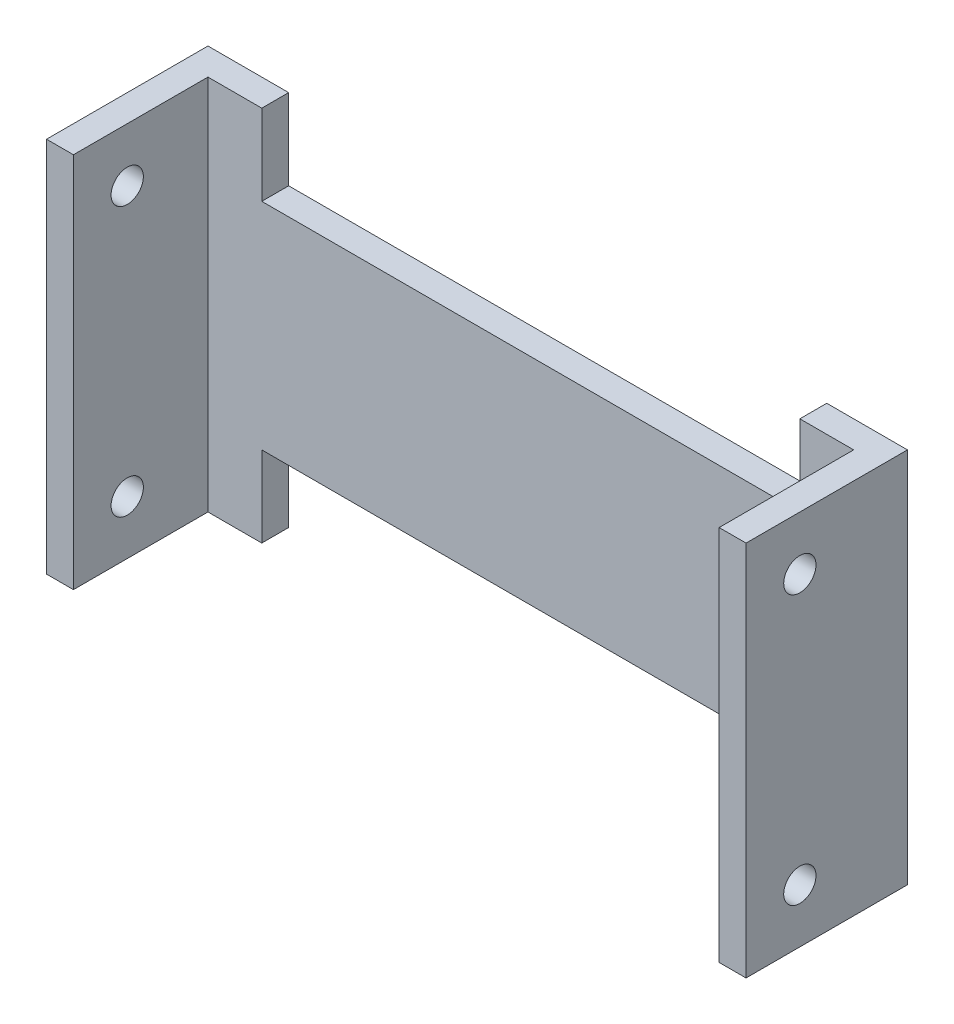
ISO-10303-21;
HEADER;
FILE_DESCRIPTION(('STEP AP214'),'2;1');
FILE_NAME('part.step','',(''),(''),'','','');
FILE_SCHEMA(('AUTOMOTIVE_DESIGN { 1 0 10303 214 1 1 1 1 }'));
ENDSEC;
DATA;
#1=APPLICATION_CONTEXT('core data for automotive mechanical design processes');
#2=APPLICATION_PROTOCOL_DEFINITION('international standard','automotive_design',2000,#1);
#3=PRODUCT_CONTEXT('',#1,'mechanical');
#4=PRODUCT('Part','Part','',(#3));
#5=PRODUCT_RELATED_PRODUCT_CATEGORY('part','',(#4));
#6=PRODUCT_DEFINITION_FORMATION('','',#4);
#7=PRODUCT_DEFINITION_CONTEXT('part definition',#1,'design');
#8=PRODUCT_DEFINITION('design','',#6,#7);
#9=PRODUCT_DEFINITION_SHAPE('','',#8);
#10=(LENGTH_UNIT() NAMED_UNIT(*) SI_UNIT(.MILLI.,.METRE.));
#11=(NAMED_UNIT(*) PLANE_ANGLE_UNIT() SI_UNIT($,.RADIAN.));
#12=(NAMED_UNIT(*) SI_UNIT($,.STERADIAN.) SOLID_ANGLE_UNIT());
#13=UNCERTAINTY_MEASURE_WITH_UNIT(LENGTH_MEASURE(1.E-05),#10,'distance_accuracy_value','');
#14=(GEOMETRIC_REPRESENTATION_CONTEXT(3) GLOBAL_UNCERTAINTY_ASSIGNED_CONTEXT((#13)) GLOBAL_UNIT_ASSIGNED_CONTEXT((#10,
#11,#12)) REPRESENTATION_CONTEXT('',''));
#15=CARTESIAN_POINT('',(0.,0.,0.));
#16=DIRECTION('',(0.,0.,1.));
#17=DIRECTION('',(1.,0.,0.));
#18=AXIS2_PLACEMENT_3D('',#15,#16,#17);
#19=CARTESIAN_POINT('',(0.,35.,0.));
#20=DIRECTION('',(0.,-1.,0.));
#21=DIRECTION('',(0.,0.,-1.));
#22=AXIS2_PLACEMENT_3D('',#19,#20,#21);
#23=PLANE('',#22);
#24=DIRECTION('',(-1.,0.,0.));
#25=VECTOR('',#24,1.);
#26=CARTESIAN_POINT('',(0.,35.,0.));
#27=LINE('',#26,#25);
#28=CARTESIAN_POINT('',(65.,35.,0.));
#29=VERTEX_POINT('',#28);
#30=CARTESIAN_POINT('',(50.,35.,0.));
#31=VERTEX_POINT('',#30);
#32=EDGE_CURVE('E330',#29,#31,#27,.T.);
#33=ORIENTED_EDGE('',*,*,#32,.T.);
#34=DIRECTION('',(0.,0.,-1.));
#35=VECTOR('',#34,1.);
#36=CARTESIAN_POINT('',(50.,35.,106.118742080783));
#37=LINE('',#36,#35);
#38=CARTESIAN_POINT('',(50.,35.,5.));
#39=VERTEX_POINT('',#38);
#40=EDGE_CURVE('E313',#39,#31,#37,.T.);
#41=ORIENTED_EDGE('',*,*,#40,.F.);
#42=DIRECTION('',(1.,0.,0.));
#43=VECTOR('',#42,1.);
#44=CARTESIAN_POINT('',(0.,35.,5.));
#45=LINE('',#44,#43);
#46=CARTESIAN_POINT('',(60.,35.,5.));
#47=VERTEX_POINT('',#46);
#48=EDGE_CURVE('E343',#39,#47,#45,.T.);
#49=ORIENTED_EDGE('',*,*,#48,.T.);
#50=DIRECTION('',(0.,0.,1.));
#51=VECTOR('',#50,1.);
#52=CARTESIAN_POINT('',(60.,35.,5.));
#53=LINE('',#52,#51);
#54=CARTESIAN_POINT('',(60.,35.,30.));
#55=VERTEX_POINT('',#54);
#56=EDGE_CURVE('E215',#47,#55,#53,.T.);
#57=ORIENTED_EDGE('',*,*,#56,.T.);
#58=DIRECTION('',(1.,0.,0.));
#59=VECTOR('',#58,1.);
#60=CARTESIAN_POINT('',(60.,35.,30.));
#61=LINE('',#60,#59);
#62=CARTESIAN_POINT('',(65.,35.,30.));
#63=VERTEX_POINT('',#62);
#64=EDGE_CURVE('E209',#55,#63,#61,.T.);
#65=ORIENTED_EDGE('',*,*,#64,.T.);
#66=DIRECTION('',(0.,0.,-1.));
#67=VECTOR('',#66,1.);
#68=CARTESIAN_POINT('',(65.,35.,0.));
#69=LINE('',#68,#67);
#70=EDGE_CURVE('E326',#63,#29,#69,.T.);
#71=ORIENTED_EDGE('',*,*,#70,.T.);
#72=EDGE_LOOP('',(#33,#41,#49,#57,#65,#71));
#73=FACE_BOUND('',#72,.T.);
#74=ADVANCED_FACE('F39',(#73),#23,.F.);
#75=CARTESIAN_POINT('',(0.,-35.,0.));
#76=DIRECTION('',(0.,-1.,0.));
#77=DIRECTION('',(0.,0.,-1.));
#78=AXIS2_PLACEMENT_3D('',#75,#76,#77);
#79=PLANE('',#78);
#80=DIRECTION('',(0.,0.,-1.));
#81=VECTOR('',#80,1.);
#82=CARTESIAN_POINT('',(50.,-35.,106.118742080783));
#83=LINE('',#82,#81);
#84=CARTESIAN_POINT('',(50.,-35.,5.));
#85=VERTEX_POINT('',#84);
#86=CARTESIAN_POINT('',(50.,-35.,0.));
#87=VERTEX_POINT('',#86);
#88=EDGE_CURVE('E277',#85,#87,#83,.T.);
#89=ORIENTED_EDGE('',*,*,#88,.T.);
#90=DIRECTION('',(-1.,0.,0.));
#91=VECTOR('',#90,1.);
#92=CARTESIAN_POINT('',(0.,-35.,0.));
#93=LINE('',#92,#91);
#94=CARTESIAN_POINT('',(65.,-35.,0.));
#95=VERTEX_POINT('',#94);
#96=EDGE_CURVE('E183',#95,#87,#93,.T.);
#97=ORIENTED_EDGE('',*,*,#96,.F.);
#98=DIRECTION('',(0.,0.,-1.));
#99=VECTOR('',#98,1.);
#100=CARTESIAN_POINT('',(65.,-35.,0.));
#101=LINE('',#100,#99);
#102=CARTESIAN_POINT('',(65.,-35.,30.));
#103=VERTEX_POINT('',#102);
#104=EDGE_CURVE('E184',#103,#95,#101,.T.);
#105=ORIENTED_EDGE('',*,*,#104,.F.);
#106=DIRECTION('',(1.,0.,0.));
#107=VECTOR('',#106,1.);
#108=CARTESIAN_POINT('',(60.,-35.,30.));
#109=LINE('',#108,#107);
#110=CARTESIAN_POINT('',(60.,-35.,30.));
#111=VERTEX_POINT('',#110);
#112=EDGE_CURVE('E189',#111,#103,#109,.T.);
#113=ORIENTED_EDGE('',*,*,#112,.F.);
#114=DIRECTION('',(0.,0.,1.));
#115=VECTOR('',#114,1.);
#116=CARTESIAN_POINT('',(60.,-35.,5.));
#117=LINE('',#116,#115);
#118=CARTESIAN_POINT('',(60.,-35.,5.));
#119=VERTEX_POINT('',#118);
#120=EDGE_CURVE('E206',#119,#111,#117,.T.);
#121=ORIENTED_EDGE('',*,*,#120,.F.);
#122=DIRECTION('',(1.,0.,0.));
#123=VECTOR('',#122,1.);
#124=CARTESIAN_POINT('',(0.,-35.,5.));
#125=LINE('',#124,#123);
#126=EDGE_CURVE('E202',#85,#119,#125,.T.);
#127=ORIENTED_EDGE('',*,*,#126,.F.);
#128=EDGE_LOOP('',(#89,#97,#105,#113,#121,#127));
#129=FACE_BOUND('',#128,.T.);
#130=ADVANCED_FACE('F358',(#129),#79,.T.);
#131=CARTESIAN_POINT('',(60.,35.,30.));
#132=DIRECTION('',(0.,0.,-1.));
#133=DIRECTION('',(-1.,0.,0.));
#134=AXIS2_PLACEMENT_3D('',#131,#132,#133);
#135=PLANE('',#134);
#136=ORIENTED_EDGE('',*,*,#112,.T.);
#137=DIRECTION('',(0.,-1.,0.));
#138=VECTOR('',#137,1.);
#139=CARTESIAN_POINT('',(65.,35.,30.));
#140=LINE('',#139,#138);
#141=EDGE_CURVE('E11',#63,#103,#140,.T.);
#142=ORIENTED_EDGE('',*,*,#141,.F.);
#143=ORIENTED_EDGE('',*,*,#64,.F.);
#144=DIRECTION('',(0.,-1.,0.));
#145=VECTOR('',#144,1.);
#146=CARTESIAN_POINT('',(60.,35.,30.));
#147=LINE('',#146,#145);
#148=EDGE_CURVE('E210',#55,#111,#147,.T.);
#149=ORIENTED_EDGE('',*,*,#148,.T.);
#150=EDGE_LOOP('',(#136,#142,#143,#149));
#151=FACE_BOUND('',#150,.T.);
#152=ADVANCED_FACE('F41',(#151),#135,.F.);
#153=CARTESIAN_POINT('',(65.,35.,0.));
#154=DIRECTION('',(-1.,0.,0.));
#155=DIRECTION('',(0.,0.,1.));
#156=AXIS2_PLACEMENT_3D('',#153,#154,#155);
#157=PLANE('',#156);
#158=CARTESIAN_POINT('',(65.,25.,20.));
#159=DIRECTION('',(-1.,0.,0.));
#160=DIRECTION('',(0.,0.,1.));
#161=AXIS2_PLACEMENT_3D('',#158,#159,#160);
#162=CIRCLE('',#161,3.);
#163=CARTESIAN_POINT('',(65.,25.,23.));
#164=VERTEX_POINT('',#163);
#165=EDGE_CURVE('E240',#164,#164,#162,.T.);
#166=ORIENTED_EDGE('',*,*,#165,.T.);
#167=EDGE_LOOP('',(#166));
#168=FACE_BOUND('',#167,.T.);
#169=CARTESIAN_POINT('',(65.,-25.,20.));
#170=DIRECTION('',(-1.,0.,0.));
#171=DIRECTION('',(0.,0.,-1.));
#172=AXIS2_PLACEMENT_3D('',#169,#170,#171);
#173=CIRCLE('',#172,3.);
#174=CARTESIAN_POINT('',(65.,-25.,17.));
#175=VERTEX_POINT('',#174);
#176=EDGE_CURVE('E254',#175,#175,#173,.T.);
#177=ORIENTED_EDGE('',*,*,#176,.T.);
#178=EDGE_LOOP('',(#177));
#179=FACE_BOUND('',#178,.T.);
#180=ORIENTED_EDGE('',*,*,#104,.T.);
#181=DIRECTION('',(0.,-1.,0.));
#182=VECTOR('',#181,1.);
#183=CARTESIAN_POINT('',(65.,35.,0.));
#184=LINE('',#183,#182);
#185=EDGE_CURVE('E49',#29,#95,#184,.T.);
#186=ORIENTED_EDGE('',*,*,#185,.F.);
#187=ORIENTED_EDGE('',*,*,#70,.F.);
#188=ORIENTED_EDGE('',*,*,#141,.T.);
#189=EDGE_LOOP('',(#180,#186,#187,#188));
#190=FACE_BOUND('',#189,.T.);
#191=ADVANCED_FACE('F362',(#168,#179,#190),#157,.F.);
#192=CARTESIAN_POINT('',(0.,35.,0.));
#193=DIRECTION('',(0.,0.,1.));
#194=DIRECTION('',(1.,0.,0.));
#195=AXIS2_PLACEMENT_3D('',#192,#193,#194);
#196=PLANE('',#195);
#197=CARTESIAN_POINT('',(0.,0.,0.));
#198=DIRECTION('',(0.,0.,-1.));
#199=DIRECTION('',(-1.,0.,0.));
#200=AXIS2_PLACEMENT_3D('',#197,#198,#199);
#201=CIRCLE('',#200,8.);
#202=CARTESIAN_POINT('',(-8.,0.,0.));
#203=VERTEX_POINT('',#202);
#204=EDGE_CURVE('E257',#203,#203,#201,.T.);
#205=ORIENTED_EDGE('',*,*,#204,.F.);
#206=EDGE_LOOP('',(#205));
#207=FACE_BOUND('',#206,.T.);
#208=ORIENTED_EDGE('',*,*,#96,.T.);
#209=DIRECTION('',(0.,-1.,0.));
#210=VECTOR('',#209,1.);
#211=CARTESIAN_POINT('',(50.,-35.,0.));
#212=LINE('',#211,#210);
#213=CARTESIAN_POINT('',(50.,-20.,0.));
#214=VERTEX_POINT('',#213);
#215=EDGE_CURVE('E164',#214,#87,#212,.T.);
#216=ORIENTED_EDGE('',*,*,#215,.F.);
#217=DIRECTION('',(1.,0.,0.));
#218=VECTOR('',#217,1.);
#219=CARTESIAN_POINT('',(50.,-20.,0.));
#220=LINE('',#219,#218);
#221=CARTESIAN_POINT('',(-50.,-20.,0.));
#222=VERTEX_POINT('',#221);
#223=EDGE_CURVE('E174',#222,#214,#220,.T.);
#224=ORIENTED_EDGE('',*,*,#223,.F.);
#225=DIRECTION('',(0.,1.,0.));
#226=VECTOR('',#225,1.);
#227=CARTESIAN_POINT('',(-50.,-20.,0.));
#228=LINE('',#227,#226);
#229=CARTESIAN_POINT('',(-50.,-35.,0.));
#230=VERTEX_POINT('',#229);
#231=EDGE_CURVE('E157',#230,#222,#228,.T.);
#232=ORIENTED_EDGE('',*,*,#231,.F.);
#233=CARTESIAN_POINT('',(-65.,-35.,0.));
#234=VERTEX_POINT('',#233);
#235=EDGE_CURVE('E170',#230,#234,#93,.T.);
#236=ORIENTED_EDGE('',*,*,#235,.T.);
#237=DIRECTION('',(0.,-1.,0.));
#238=VECTOR('',#237,1.);
#239=CARTESIAN_POINT('',(-65.,35.,0.));
#240=LINE('',#239,#238);
#241=CARTESIAN_POINT('',(-65.,35.,0.));
#242=VERTEX_POINT('',#241);
#243=EDGE_CURVE('E231',#242,#234,#240,.T.);
#244=ORIENTED_EDGE('',*,*,#243,.F.);
#245=CARTESIAN_POINT('',(-50.,35.,0.));
#246=VERTEX_POINT('',#245);
#247=EDGE_CURVE('E329',#246,#242,#27,.T.);
#248=ORIENTED_EDGE('',*,*,#247,.F.);
#249=DIRECTION('',(0.,1.,0.));
#250=VECTOR('',#249,1.);
#251=CARTESIAN_POINT('',(-50.,20.,0.));
#252=LINE('',#251,#250);
#253=CARTESIAN_POINT('',(-50.,20.,0.));
#254=VERTEX_POINT('',#253);
#255=EDGE_CURVE('E57',#254,#246,#252,.T.);
#256=ORIENTED_EDGE('',*,*,#255,.F.);
#257=DIRECTION('',(-1.,0.,0.));
#258=VECTOR('',#257,1.);
#259=CARTESIAN_POINT('',(50.,20.,0.));
#260=LINE('',#259,#258);
#261=CARTESIAN_POINT('',(50.,20.,0.));
#262=VERTEX_POINT('',#261);
#263=EDGE_CURVE('E272',#262,#254,#260,.T.);
#264=ORIENTED_EDGE('',*,*,#263,.F.);
#265=DIRECTION('',(0.,-1.,0.));
#266=VECTOR('',#265,1.);
#267=CARTESIAN_POINT('',(50.,35.,0.));
#268=LINE('',#267,#266);
#269=EDGE_CURVE('E306',#31,#262,#268,.T.);
#270=ORIENTED_EDGE('',*,*,#269,.F.);
#271=ORIENTED_EDGE('',*,*,#32,.F.);
#272=ORIENTED_EDGE('',*,*,#185,.T.);
#273=EDGE_LOOP('',(#208,#216,#224,#232,#236,#244,#248,#256,#264,#270,#271,#272));
#274=FACE_BOUND('',#273,.T.);
#275=ADVANCED_FACE('F168',(#207,#274),#196,.F.);
#276=CARTESIAN_POINT('',(-65.,35.,0.));
#277=DIRECTION('',(1.,0.,0.));
#278=DIRECTION('',(0.,0.,-1.));
#279=AXIS2_PLACEMENT_3D('',#276,#277,#278);
#280=PLANE('',#279);
#281=CARTESIAN_POINT('',(-65.,25.,20.));
#282=DIRECTION('',(-1.,0.,0.));
#283=DIRECTION('',(0.,0.,1.));
#284=AXIS2_PLACEMENT_3D('',#281,#282,#283);
#285=CIRCLE('',#284,3.);
#286=CARTESIAN_POINT('',(-65.,25.,23.));
#287=VERTEX_POINT('',#286);
#288=EDGE_CURVE('E248',#287,#287,#285,.T.);
#289=ORIENTED_EDGE('',*,*,#288,.F.);
#290=EDGE_LOOP('',(#289));
#291=FACE_BOUND('',#290,.T.);
#292=CARTESIAN_POINT('',(-65.,-25.,20.));
#293=DIRECTION('',(-1.,0.,0.));
#294=DIRECTION('',(0.,0.,-1.));
#295=AXIS2_PLACEMENT_3D('',#292,#293,#294);
#296=CIRCLE('',#295,3.);
#297=CARTESIAN_POINT('',(-65.,-25.,17.));
#298=VERTEX_POINT('',#297);
#299=EDGE_CURVE('E263',#298,#298,#296,.T.);
#300=ORIENTED_EDGE('',*,*,#299,.F.);
#301=EDGE_LOOP('',(#300));
#302=FACE_BOUND('',#301,.T.);
#303=DIRECTION('',(0.,0.,1.));
#304=VECTOR('',#303,1.);
#305=CARTESIAN_POINT('',(-65.,-35.,0.));
#306=LINE('',#305,#304);
#307=CARTESIAN_POINT('',(-65.,-35.,30.));
#308=VERTEX_POINT('',#307);
#309=EDGE_CURVE('E181',#234,#308,#306,.T.);
#310=ORIENTED_EDGE('',*,*,#309,.T.);
#311=DIRECTION('',(0.,-1.,0.));
#312=VECTOR('',#311,1.);
#313=CARTESIAN_POINT('',(-65.,35.,30.));
#314=LINE('',#313,#312);
#315=CARTESIAN_POINT('',(-65.,35.,30.));
#316=VERTEX_POINT('',#315);
#317=EDGE_CURVE('E227',#316,#308,#314,.T.);
#318=ORIENTED_EDGE('',*,*,#317,.F.);
#319=DIRECTION('',(0.,0.,1.));
#320=VECTOR('',#319,1.);
#321=CARTESIAN_POINT('',(-65.,35.,0.));
#322=LINE('',#321,#320);
#323=EDGE_CURVE('E334',#242,#316,#322,.T.);
#324=ORIENTED_EDGE('',*,*,#323,.F.);
#325=ORIENTED_EDGE('',*,*,#243,.T.);
#326=EDGE_LOOP('',(#310,#318,#324,#325));
#327=FACE_BOUND('',#326,.T.);
#328=ADVANCED_FACE('F385',(#291,#302,#327),#280,.F.);
#329=CARTESIAN_POINT('',(-60.,35.,30.));
#330=DIRECTION('',(0.,0.,-1.));
#331=DIRECTION('',(-1.,0.,0.));
#332=AXIS2_PLACEMENT_3D('',#329,#330,#331);
#333=PLANE('',#332);
#334=DIRECTION('',(1.,0.,0.));
#335=VECTOR('',#334,1.);
#336=CARTESIAN_POINT('',(-60.,-35.,30.));
#337=LINE('',#336,#335);
#338=CARTESIAN_POINT('',(-60.,-35.,30.));
#339=VERTEX_POINT('',#338);
#340=EDGE_CURVE('E195',#308,#339,#337,.T.);
#341=ORIENTED_EDGE('',*,*,#340,.T.);
#342=DIRECTION('',(0.,-1.,0.));
#343=VECTOR('',#342,1.);
#344=CARTESIAN_POINT('',(-60.,35.,30.));
#345=LINE('',#344,#343);
#346=CARTESIAN_POINT('',(-60.,35.,30.));
#347=VERTEX_POINT('',#346);
#348=EDGE_CURVE('E223',#347,#339,#345,.T.);
#349=ORIENTED_EDGE('',*,*,#348,.F.);
#350=DIRECTION('',(1.,0.,0.));
#351=VECTOR('',#350,1.);
#352=CARTESIAN_POINT('',(-60.,35.,30.));
#353=LINE('',#352,#351);
#354=EDGE_CURVE('E337',#316,#347,#353,.T.);
#355=ORIENTED_EDGE('',*,*,#354,.F.);
#356=ORIENTED_EDGE('',*,*,#317,.T.);
#357=EDGE_LOOP('',(#341,#349,#355,#356));
#358=FACE_BOUND('',#357,.T.);
#359=ADVANCED_FACE('F389',(#358),#333,.F.);
#360=CARTESIAN_POINT('',(-60.,35.,5.00000000000002));
#361=DIRECTION('',(-1.,0.,0.));
#362=DIRECTION('',(0.,0.,1.));
#363=AXIS2_PLACEMENT_3D('',#360,#361,#362);
#364=PLANE('',#363);
#365=CARTESIAN_POINT('',(-60.,25.,20.));
#366=DIRECTION('',(-1.,0.,0.));
#367=DIRECTION('',(0.,0.,1.));
#368=AXIS2_PLACEMENT_3D('',#365,#366,#367);
#369=CIRCLE('',#368,3.);
#370=CARTESIAN_POINT('',(-60.,25.,23.));
#371=VERTEX_POINT('',#370);
#372=EDGE_CURVE('E268',#371,#371,#369,.T.);
#373=ORIENTED_EDGE('',*,*,#372,.T.);
#374=EDGE_LOOP('',(#373));
#375=FACE_BOUND('',#374,.T.);
#376=CARTESIAN_POINT('',(-60.,-25.,20.));
#377=DIRECTION('',(-1.,0.,0.));
#378=DIRECTION('',(0.,0.,1.));
#379=AXIS2_PLACEMENT_3D('',#376,#377,#378);
#380=CIRCLE('',#379,3.);
#381=CARTESIAN_POINT('',(-60.,-25.,23.));
#382=VERTEX_POINT('',#381);
#383=EDGE_CURVE('E239',#382,#382,#380,.T.);
#384=ORIENTED_EDGE('',*,*,#383,.T.);
#385=EDGE_LOOP('',(#384));
#386=FACE_BOUND('',#385,.T.);
#387=DIRECTION('',(0.,0.,-1.));
#388=VECTOR('',#387,1.);
#389=CARTESIAN_POINT('',(-60.,-35.,5.00000000000002));
#390=LINE('',#389,#388);
#391=CARTESIAN_POINT('',(-60.,-35.,5.00000000000002));
#392=VERTEX_POINT('',#391);
#393=EDGE_CURVE('E198',#339,#392,#390,.T.);
#394=ORIENTED_EDGE('',*,*,#393,.T.);
#395=DIRECTION('',(0.,-1.,0.));
#396=VECTOR('',#395,1.);
#397=CARTESIAN_POINT('',(-60.,35.,5.00000000000002));
#398=LINE('',#397,#396);
#399=CARTESIAN_POINT('',(-60.,35.,5.00000000000002));
#400=VERTEX_POINT('',#399);
#401=EDGE_CURVE('E219',#400,#392,#398,.T.);
#402=ORIENTED_EDGE('',*,*,#401,.F.);
#403=DIRECTION('',(0.,0.,-1.));
#404=VECTOR('',#403,1.);
#405=CARTESIAN_POINT('',(-60.,35.,5.00000000000002));
#406=LINE('',#405,#404);
#407=EDGE_CURVE('E340',#347,#400,#406,.T.);
#408=ORIENTED_EDGE('',*,*,#407,.F.);
#409=ORIENTED_EDGE('',*,*,#348,.T.);
#410=EDGE_LOOP('',(#394,#402,#408,#409));
#411=FACE_BOUND('',#410,.T.);
#412=ADVANCED_FACE('F394',(#375,#386,#411),#364,.F.);
#413=CARTESIAN_POINT('',(0.,35.,5.));
#414=DIRECTION('',(0.,0.,-1.));
#415=DIRECTION('',(-1.,0.,0.));
#416=AXIS2_PLACEMENT_3D('',#413,#414,#415);
#417=PLANE('',#416);
#418=DIRECTION('',(-1.,0.,0.));
#419=VECTOR('',#418,1.);
#420=CARTESIAN_POINT('',(50.,-20.,5.));
#421=LINE('',#420,#419);
#422=CARTESIAN_POINT('',(50.,-20.,5.));
#423=VERTEX_POINT('',#422);
#424=CARTESIAN_POINT('',(-50.,-20.,5.00000000000003));
#425=VERTEX_POINT('',#424);
#426=EDGE_CURVE('E273',#423,#425,#421,.T.);
#427=ORIENTED_EDGE('',*,*,#426,.F.);
#428=DIRECTION('',(0.,1.,0.));
#429=VECTOR('',#428,1.);
#430=CARTESIAN_POINT('',(50.,-35.,5.));
#431=LINE('',#430,#429);
#432=EDGE_CURVE('E276',#85,#423,#431,.T.);
#433=ORIENTED_EDGE('',*,*,#432,.F.);
#434=ORIENTED_EDGE('',*,*,#126,.T.);
#435=DIRECTION('',(0.,-1.,0.));
#436=VECTOR('',#435,1.);
#437=CARTESIAN_POINT('',(60.,35.,5.));
#438=LINE('',#437,#436);
#439=EDGE_CURVE('E214',#47,#119,#438,.T.);
#440=ORIENTED_EDGE('',*,*,#439,.F.);
#441=ORIENTED_EDGE('',*,*,#48,.F.);
#442=DIRECTION('',(0.,1.,0.));
#443=VECTOR('',#442,1.);
#444=CARTESIAN_POINT('',(50.,35.,5.));
#445=LINE('',#444,#443);
#446=CARTESIAN_POINT('',(50.,20.,5.));
#447=VERTEX_POINT('',#446);
#448=EDGE_CURVE('E294',#447,#39,#445,.T.);
#449=ORIENTED_EDGE('',*,*,#448,.F.);
#450=DIRECTION('',(1.,0.,0.));
#451=VECTOR('',#450,1.);
#452=CARTESIAN_POINT('',(50.,20.,5.));
#453=LINE('',#452,#451);
#454=CARTESIAN_POINT('',(-50.,20.,5.));
#455=VERTEX_POINT('',#454);
#456=EDGE_CURVE('E297',#455,#447,#453,.T.);
#457=ORIENTED_EDGE('',*,*,#456,.F.);
#458=DIRECTION('',(0.,-1.,0.));
#459=VECTOR('',#458,1.);
#460=CARTESIAN_POINT('',(-50.,20.,5.));
#461=LINE('',#460,#459);
#462=CARTESIAN_POINT('',(-50.,35.,5.00000000000003));
#463=VERTEX_POINT('',#462);
#464=EDGE_CURVE('E176',#463,#455,#461,.T.);
#465=ORIENTED_EDGE('',*,*,#464,.F.);
#466=EDGE_CURVE('E344',#400,#463,#45,.T.);
#467=ORIENTED_EDGE('',*,*,#466,.F.);
#468=ORIENTED_EDGE('',*,*,#401,.T.);
#469=CARTESIAN_POINT('',(-50.,-35.,5.00000000000001));
#470=VERTEX_POINT('',#469);
#471=EDGE_CURVE('E203',#392,#470,#125,.T.);
#472=ORIENTED_EDGE('',*,*,#471,.T.);
#473=DIRECTION('',(0.,-1.,0.));
#474=VECTOR('',#473,1.);
#475=CARTESIAN_POINT('',(-50.,-20.,5.));
#476=LINE('',#475,#474);
#477=EDGE_CURVE('E65',#425,#470,#476,.T.);
#478=ORIENTED_EDGE('',*,*,#477,.F.);
#479=EDGE_LOOP('',(#427,#433,#434,#440,#441,#449,#457,#465,#467,#468,#472,#478));
#480=FACE_BOUND('',#479,.T.);
#481=ADVANCED_FACE('F373',(#480),#417,.F.);
#482=CARTESIAN_POINT('',(60.,35.,5.));
#483=DIRECTION('',(1.,0.,0.));
#484=DIRECTION('',(0.,0.,-1.));
#485=AXIS2_PLACEMENT_3D('',#482,#483,#484);
#486=PLANE('',#485);
#487=CARTESIAN_POINT('',(60.,25.,20.));
#488=DIRECTION('',(1.,0.,0.));
#489=DIRECTION('',(0.,0.,-1.));
#490=AXIS2_PLACEMENT_3D('',#487,#488,#489);
#491=CIRCLE('',#490,3.);
#492=CARTESIAN_POINT('',(60.,25.,17.));
#493=VERTEX_POINT('',#492);
#494=EDGE_CURVE('E43',#493,#493,#491,.T.);
#495=ORIENTED_EDGE('',*,*,#494,.T.);
#496=EDGE_LOOP('',(#495));
#497=FACE_BOUND('',#496,.T.);
#498=CARTESIAN_POINT('',(60.,-25.,20.));
#499=DIRECTION('',(1.,0.,0.));
#500=DIRECTION('',(0.,0.,-1.));
#501=AXIS2_PLACEMENT_3D('',#498,#499,#500);
#502=CIRCLE('',#501,3.);
#503=CARTESIAN_POINT('',(60.,-25.,17.));
#504=VERTEX_POINT('',#503);
#505=EDGE_CURVE('E236',#504,#504,#502,.T.);
#506=ORIENTED_EDGE('',*,*,#505,.T.);
#507=EDGE_LOOP('',(#506));
#508=FACE_BOUND('',#507,.T.);
#509=ORIENTED_EDGE('',*,*,#120,.T.);
#510=ORIENTED_EDGE('',*,*,#148,.F.);
#511=ORIENTED_EDGE('',*,*,#56,.F.);
#512=ORIENTED_EDGE('',*,*,#439,.T.);
#513=EDGE_LOOP('',(#509,#510,#511,#512));
#514=FACE_BOUND('',#513,.T.);
#515=ADVANCED_FACE('F370',(#497,#508,#514),#486,.F.);
#516=ORIENTED_EDGE('',*,*,#466,.T.);
#517=DIRECTION('',(0.,0.,-1.));
#518=VECTOR('',#517,1.);
#519=CARTESIAN_POINT('',(-50.,35.,106.118742080783));
#520=LINE('',#519,#518);
#521=EDGE_CURVE('E316',#463,#246,#520,.T.);
#522=ORIENTED_EDGE('',*,*,#521,.T.);
#523=ORIENTED_EDGE('',*,*,#247,.T.);
#524=ORIENTED_EDGE('',*,*,#323,.T.);
#525=ORIENTED_EDGE('',*,*,#354,.T.);
#526=ORIENTED_EDGE('',*,*,#407,.T.);
#527=EDGE_LOOP('',(#516,#522,#523,#524,#525,#526));
#528=FACE_BOUND('',#527,.T.);
#529=ADVANCED_FACE('F381',(#528),#23,.F.);
#530=DIRECTION('',(0.,0.,-1.));
#531=VECTOR('',#530,1.);
#532=CARTESIAN_POINT('',(-50.,-35.,106.118742080783));
#533=LINE('',#532,#531);
#534=EDGE_CURVE('E154',#470,#230,#533,.T.);
#535=ORIENTED_EDGE('',*,*,#534,.F.);
#536=ORIENTED_EDGE('',*,*,#471,.F.);
#537=ORIENTED_EDGE('',*,*,#393,.F.);
#538=ORIENTED_EDGE('',*,*,#340,.F.);
#539=ORIENTED_EDGE('',*,*,#309,.F.);
#540=ORIENTED_EDGE('',*,*,#235,.F.);
#541=EDGE_LOOP('',(#535,#536,#537,#538,#539,#540));
#542=FACE_BOUND('',#541,.T.);
#543=ADVANCED_FACE('F179',(#542),#79,.T.);
#544=CARTESIAN_POINT('',(50.,-35.,106.118742080783));
#545=DIRECTION('',(1.,0.,0.));
#546=DIRECTION('',(0.,0.,-1.));
#547=AXIS2_PLACEMENT_3D('',#544,#545,#546);
#548=PLANE('',#547);
#549=ORIENTED_EDGE('',*,*,#432,.T.);
#550=DIRECTION('',(0.,0.,-1.));
#551=VECTOR('',#550,1.);
#552=CARTESIAN_POINT('',(50.,-20.,106.118742080783));
#553=LINE('',#552,#551);
#554=EDGE_CURVE('E287',#423,#214,#553,.T.);
#555=ORIENTED_EDGE('',*,*,#554,.T.);
#556=ORIENTED_EDGE('',*,*,#215,.T.);
#557=ORIENTED_EDGE('',*,*,#88,.F.);
#558=EDGE_LOOP('',(#549,#555,#556,#557));
#559=FACE_BOUND('',#558,.T.);
#560=ADVANCED_FACE('F428',(#559),#548,.F.);
#561=CARTESIAN_POINT('',(50.,-20.,106.118742080783));
#562=DIRECTION('',(0.,1.,0.));
#563=DIRECTION('',(-1.,0.,0.));
#564=AXIS2_PLACEMENT_3D('',#561,#562,#563);
#565=PLANE('',#564);
#566=ORIENTED_EDGE('',*,*,#426,.T.);
#567=DIRECTION('',(0.,0.,-1.));
#568=VECTOR('',#567,1.);
#569=CARTESIAN_POINT('',(-50.,-20.,106.118742080783));
#570=LINE('',#569,#568);
#571=EDGE_CURVE('E163',#425,#222,#570,.T.);
#572=ORIENTED_EDGE('',*,*,#571,.T.);
#573=ORIENTED_EDGE('',*,*,#223,.T.);
#574=ORIENTED_EDGE('',*,*,#554,.F.);
#575=EDGE_LOOP('',(#566,#572,#573,#574));
#576=FACE_BOUND('',#575,.T.);
#577=ADVANCED_FACE('F576',(#576),#565,.F.);
#578=CARTESIAN_POINT('',(-50.,-20.,106.118742080783));
#579=DIRECTION('',(-1.,0.,0.));
#580=DIRECTION('',(0.,-1.,0.));
#581=AXIS2_PLACEMENT_3D('',#578,#579,#580);
#582=PLANE('',#581);
#583=ORIENTED_EDGE('',*,*,#477,.T.);
#584=ORIENTED_EDGE('',*,*,#534,.T.);
#585=ORIENTED_EDGE('',*,*,#231,.T.);
#586=ORIENTED_EDGE('',*,*,#571,.F.);
#587=EDGE_LOOP('',(#583,#584,#585,#586));
#588=FACE_BOUND('',#587,.T.);
#589=ADVANCED_FACE('F156',(#588),#582,.F.);
#590=CARTESIAN_POINT('',(50.,20.,106.118742080783));
#591=DIRECTION('',(0.,-1.,0.));
#592=DIRECTION('',(1.,0.,0.));
#593=AXIS2_PLACEMENT_3D('',#590,#591,#592);
#594=PLANE('',#593);
#595=ORIENTED_EDGE('',*,*,#456,.T.);
#596=DIRECTION('',(0.,0.,-1.));
#597=VECTOR('',#596,1.);
#598=CARTESIAN_POINT('',(50.,20.,106.118742080783));
#599=LINE('',#598,#597);
#600=EDGE_CURVE('E298',#447,#262,#599,.T.);
#601=ORIENTED_EDGE('',*,*,#600,.T.);
#602=ORIENTED_EDGE('',*,*,#263,.T.);
#603=DIRECTION('',(0.,0.,-1.));
#604=VECTOR('',#603,1.);
#605=CARTESIAN_POINT('',(-50.,20.,106.118742080783));
#606=LINE('',#605,#604);
#607=EDGE_CURVE('E310',#455,#254,#606,.T.);
#608=ORIENTED_EDGE('',*,*,#607,.F.);
#609=EDGE_LOOP('',(#595,#601,#602,#608));
#610=FACE_BOUND('',#609,.T.);
#611=ADVANCED_FACE('F401',(#610),#594,.F.);
#612=CARTESIAN_POINT('',(50.,35.,106.118742080783));
#613=DIRECTION('',(1.,0.,0.));
#614=DIRECTION('',(0.,1.,0.));
#615=AXIS2_PLACEMENT_3D('',#612,#613,#614);
#616=PLANE('',#615);
#617=ORIENTED_EDGE('',*,*,#448,.T.);
#618=ORIENTED_EDGE('',*,*,#40,.T.);
#619=ORIENTED_EDGE('',*,*,#269,.T.);
#620=ORIENTED_EDGE('',*,*,#600,.F.);
#621=EDGE_LOOP('',(#617,#618,#619,#620));
#622=FACE_BOUND('',#621,.T.);
#623=ADVANCED_FACE('F406',(#622),#616,.F.);
#624=CARTESIAN_POINT('',(-50.,20.,106.118742080783));
#625=DIRECTION('',(-1.,0.,0.));
#626=DIRECTION('',(0.,-1.,0.));
#627=AXIS2_PLACEMENT_3D('',#624,#625,#626);
#628=PLANE('',#627);
#629=ORIENTED_EDGE('',*,*,#464,.T.);
#630=ORIENTED_EDGE('',*,*,#607,.T.);
#631=ORIENTED_EDGE('',*,*,#255,.T.);
#632=ORIENTED_EDGE('',*,*,#521,.F.);
#633=EDGE_LOOP('',(#629,#630,#631,#632));
#634=FACE_BOUND('',#633,.T.);
#635=ADVANCED_FACE('F399',(#634),#628,.F.);
#636=CARTESIAN_POINT('',(65.,-25.,20.));
#637=DIRECTION('',(-1.,0.,0.));
#638=DIRECTION('',(0.,0.,1.));
#639=AXIS2_PLACEMENT_3D('',#636,#637,#638);
#640=CYLINDRICAL_SURFACE('',#639,3.);
#641=ORIENTED_EDGE('',*,*,#176,.F.);
#642=EDGE_LOOP('',(#641));
#643=FACE_BOUND('',#642,.T.);
#644=ORIENTED_EDGE('',*,*,#505,.F.);
#645=EDGE_LOOP('',(#644));
#646=FACE_BOUND('',#645,.T.);
#647=ADVANCED_FACE('F413',(#643,#646),#640,.F.);
#648=CARTESIAN_POINT('',(65.,25.,20.));
#649=DIRECTION('',(-1.,0.,0.));
#650=DIRECTION('',(0.,0.,1.));
#651=AXIS2_PLACEMENT_3D('',#648,#649,#650);
#652=CYLINDRICAL_SURFACE('',#651,3.);
#653=ORIENTED_EDGE('',*,*,#165,.F.);
#654=EDGE_LOOP('',(#653));
#655=FACE_BOUND('',#654,.T.);
#656=ORIENTED_EDGE('',*,*,#494,.F.);
#657=EDGE_LOOP('',(#656));
#658=FACE_BOUND('',#657,.T.);
#659=ADVANCED_FACE('F456',(#655,#658),#652,.F.);
#660=ORIENTED_EDGE('',*,*,#299,.T.);
#661=EDGE_LOOP('',(#660));
#662=FACE_BOUND('',#661,.T.);
#663=ORIENTED_EDGE('',*,*,#383,.F.);
#664=EDGE_LOOP('',(#663));
#665=FACE_BOUND('',#664,.T.);
#666=ADVANCED_FACE('F458',(#662,#665),#640,.F.);
#667=ORIENTED_EDGE('',*,*,#288,.T.);
#668=EDGE_LOOP('',(#667));
#669=FACE_BOUND('',#668,.T.);
#670=ORIENTED_EDGE('',*,*,#372,.F.);
#671=EDGE_LOOP('',(#670));
#672=FACE_BOUND('',#671,.T.);
#673=ADVANCED_FACE('F464',(#669,#672),#652,.F.);
#674=CARTESIAN_POINT('',(0.,0.,3.));
#675=DIRECTION('',(0.,0.,-1.));
#676=DIRECTION('',(-1.,0.,0.));
#677=AXIS2_PLACEMENT_3D('',#674,#675,#676);
#678=CYLINDRICAL_SURFACE('',#677,8.);
#679=CARTESIAN_POINT('',(0.,0.,3.));
#680=DIRECTION('',(0.,0.,-1.));
#681=DIRECTION('',(-1.,0.,0.));
#682=AXIS2_PLACEMENT_3D('',#679,#680,#681);
#683=CIRCLE('',#682,8.);
#684=CARTESIAN_POINT('',(-8.,0.,3.));
#685=VERTEX_POINT('',#684);
#686=EDGE_CURVE('E266',#685,#685,#683,.T.);
#687=ORIENTED_EDGE('',*,*,#686,.F.);
#688=EDGE_LOOP('',(#687));
#689=FACE_BOUND('',#688,.T.);
#690=ORIENTED_EDGE('',*,*,#204,.T.);
#691=EDGE_LOOP('',(#690));
#692=FACE_BOUND('',#691,.T.);
#693=ADVANCED_FACE('F471',(#689,#692),#678,.F.);
#694=CARTESIAN_POINT('',(0.,0.,3.));
#695=DIRECTION('',(0.,0.,-1.));
#696=DIRECTION('',(-1.,0.,0.));
#697=AXIS2_PLACEMENT_3D('',#694,#695,#696);
#698=PLANE('',#697);
#699=ORIENTED_EDGE('',*,*,#686,.T.);
#700=EDGE_LOOP('',(#699));
#701=FACE_BOUND('',#700,.T.);
#702=ADVANCED_FACE('F481',(#701),#698,.T.);
#703=CLOSED_SHELL('',(#74,#130,#152,#191,#275,#328,#359,#412,#481,#515,#529,#543,#560,#577,#589,
#611,#623,#635,#647,#659,#666,#673,#693,#702));
#704=MANIFOLD_SOLID_BREP('B2',#703);
#705=ADVANCED_BREP_SHAPE_REPRESENTATION('',(#18,#704),#14);
#706=SHAPE_DEFINITION_REPRESENTATION(#9,#705);
ENDSEC;
END-ISO-10303-21;
